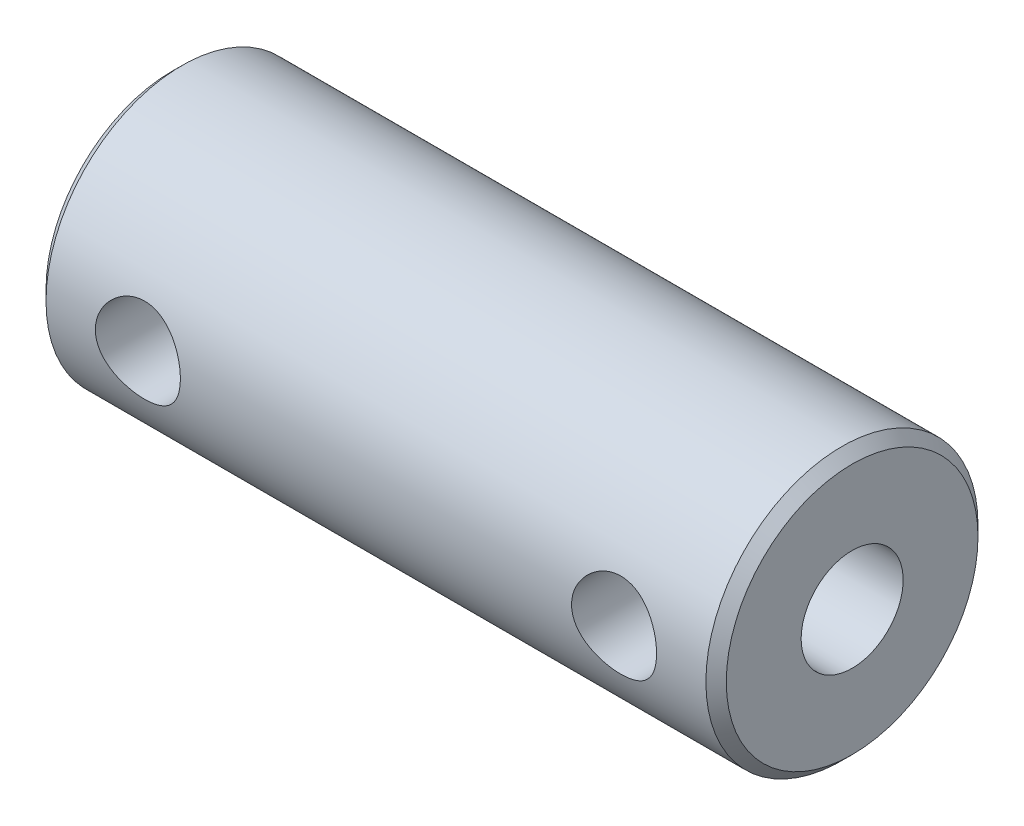
ISO-10303-21;
HEADER;
FILE_DESCRIPTION(('STEP AP214'),'2;1');
FILE_NAME('part.step','',(''),(''),'','','');
FILE_SCHEMA(('AUTOMOTIVE_DESIGN { 1 0 10303 214 1 1 1 1 }'));
ENDSEC;
DATA;
#1=APPLICATION_CONTEXT('core data for automotive mechanical design processes');
#2=APPLICATION_PROTOCOL_DEFINITION('international standard','automotive_design',2000,#1);
#3=PRODUCT_CONTEXT('',#1,'mechanical');
#4=PRODUCT('Part','Part','',(#3));
#5=PRODUCT_RELATED_PRODUCT_CATEGORY('part','',(#4));
#6=PRODUCT_DEFINITION_FORMATION('','',#4);
#7=PRODUCT_DEFINITION_CONTEXT('part definition',#1,'design');
#8=PRODUCT_DEFINITION('design','',#6,#7);
#9=PRODUCT_DEFINITION_SHAPE('','',#8);
#10=(LENGTH_UNIT() NAMED_UNIT(*) SI_UNIT(.MILLI.,.METRE.));
#11=(NAMED_UNIT(*) PLANE_ANGLE_UNIT() SI_UNIT($,.RADIAN.));
#12=(NAMED_UNIT(*) SI_UNIT($,.STERADIAN.) SOLID_ANGLE_UNIT());
#13=UNCERTAINTY_MEASURE_WITH_UNIT(LENGTH_MEASURE(1.E-05),#10,'distance_accuracy_value','');
#14=(GEOMETRIC_REPRESENTATION_CONTEXT(3) GLOBAL_UNCERTAINTY_ASSIGNED_CONTEXT((#13)) GLOBAL_UNIT_ASSIGNED_CONTEXT((#10,
#11,#12)) REPRESENTATION_CONTEXT('',''));
#15=CARTESIAN_POINT('',(0.,0.,0.));
#16=DIRECTION('',(0.,0.,1.));
#17=DIRECTION('',(1.,0.,0.));
#18=AXIS2_PLACEMENT_3D('',#15,#16,#17);
#19=CARTESIAN_POINT('',(-9.07995153098626,0.,0.));
#20=DIRECTION('',(-1.,0.,0.));
#21=DIRECTION('',(0.,0.,1.));
#22=AXIS2_PLACEMENT_3D('',#19,#20,#21);
#23=CYLINDRICAL_SURFACE('',#22,1.5);
#24=CARTESIAN_POINT('',(0.,0.,0.));
#25=DIRECTION('',(-1.,0.,0.));
#26=DIRECTION('',(0.,0.,1.));
#27=AXIS2_PLACEMENT_3D('',#24,#25,#26);
#28=CIRCLE('',#27,1.5);
#29=CARTESIAN_POINT('',(0.,0.,1.5));
#30=VERTEX_POINT('',#29);
#31=EDGE_CURVE('E133',#30,#30,#28,.T.);
#32=ORIENTED_EDGE('',*,*,#31,.T.);
#33=EDGE_LOOP('',(#32));
#34=FACE_BOUND('',#33,.T.);
#35=CARTESIAN_POINT('',(10.,0.,0.));
#36=DIRECTION('',(-1.,0.,0.));
#37=DIRECTION('',(0.,0.,1.));
#38=AXIS2_PLACEMENT_3D('',#35,#36,#37);
#39=CIRCLE('',#38,1.5);
#40=CARTESIAN_POINT('',(10.,0.,1.5));
#41=VERTEX_POINT('',#40);
#42=EDGE_CURVE('E136',#41,#41,#39,.T.);
#43=ORIENTED_EDGE('',*,*,#42,.F.);
#44=EDGE_LOOP('',(#43));
#45=FACE_BOUND('',#44,.T.);
#46=DIRECTION('',(-1.,0.,0.));
#47=VECTOR('',#46,1.);
#48=CARTESIAN_POINT('',(-9.07995153098626,1.01980390271856,1.1));
#49=LINE('',#48,#47);
#50=CARTESIAN_POINT('',(6.27715838525995,1.01980390271856,1.1));
#51=VERTEX_POINT('',#50);
#52=CARTESIAN_POINT('',(7.72284161474005,1.01980390271856,1.1));
#53=VERTEX_POINT('',#52);
#54=EDGE_CURVE('E11',#51,#53,#49,.F.);
#55=ORIENTED_EDGE('',*,*,#54,.F.);
#56=CARTESIAN_POINT('',(6.27715838525995,1.01980390271856,1.1));
#57=CARTESIAN_POINT('',(6.24785259282519,0.999017405526167,1.11927208545593));
#58=CARTESIAN_POINT('',(6.21946319998509,0.977009652242892,1.13857750945756));
#59=CARTESIAN_POINT('',(6.16453728134246,0.930487550768675,1.17690395854617));
#60=CARTESIAN_POINT('',(6.13800305191533,0.905970185426996,1.19592460903198));
#61=CARTESIAN_POINT('',(6.06096012847509,0.82827766767481,1.25222113353282));
#62=CARTESIAN_POINT('',(6.01342270298448,0.771251461066706,1.2884515372652));
#63=CARTESIAN_POINT('',(5.93683848070769,0.660115877649062,1.34809819249946));
#64=CARTESIAN_POINT('',(5.90600010710047,0.607829227947241,1.37261631231153));
#65=CARTESIAN_POINT('',(5.85168426404333,0.497621220402377,1.4162865896349));
#66=CARTESIAN_POINT('',(5.82818588913886,0.439716492670978,1.43545396999627));
#67=CARTESIAN_POINT('',(5.78962628254963,0.31869068161912,1.46709987769286));
#68=CARTESIAN_POINT('',(5.77465147957765,0.255523358584458,1.47950983204791));
#69=CARTESIAN_POINT('',(5.7547164693351,0.126546376993038,1.49606116121764));
#70=CARTESIAN_POINT('',(5.74975114698085,0.0607380855797199,1.50020675930374));
#71=CARTESIAN_POINT('',(5.75023095389339,-0.0611130290716277,1.49980806601887));
#72=CARTESIAN_POINT('',(5.75425655686159,-0.117173076205809,1.49644867267506));
#73=CARTESIAN_POINT('',(5.76962429301585,-0.227549935725818,1.48367985569633));
#74=CARTESIAN_POINT('',(5.78096525205282,-0.281867026395948,1.47427140296472));
#75=CARTESIAN_POINT('',(5.81008702175102,-0.386692076125774,1.45028482376772));
#76=CARTESIAN_POINT('',(5.82778008437459,-0.437241120707928,1.43577719211559));
#77=CARTESIAN_POINT('',(5.86880472989011,-0.534498808995069,1.40248310562481));
#78=CARTESIAN_POINT('',(5.89214132187734,-0.58120399131979,1.38369285046374));
#79=CARTESIAN_POINT('',(5.95473696669298,-0.689447607096832,1.33400604263065));
#80=CARTESIAN_POINT('',(5.99652791984288,-0.748729637974959,1.30137792620423));
#81=CARTESIAN_POINT('',(6.08810762633757,-0.85793741825479,1.23212182114316));
#82=CARTESIAN_POINT('',(6.13789966099809,-0.907859310700042,1.19549219343439));
#83=CARTESIAN_POINT('',(6.21893181140383,-0.9765929361314,1.13894818846832));
#84=CARTESIAN_POINT('',(6.24760224156318,-0.998834091657571,1.11945154799667));
#85=CARTESIAN_POINT('',(6.27715838525961,-1.01980390271899,1.10000000000004));
#86=B_SPLINE_CURVE_WITH_KNOTS('',3,(#56,#57,#58,#59,#60,#61,#62,#63,#64,#65,#66,#67,#68,#69,#70,
#71,#72,#73,#74,#75,#76,#77,#78,#79,#80,#81,#82,#83,#84,#85),.UNSPECIFIED.,.F.,.F.,(4,2,2,2,2,2,
2,2,2,2,2,2,2,2,4),(0.,0.122242169138908,0.244633068136593,0.491124183491871,0.686794669415566,
0.881902663882364,1.07895532935393,1.275907270654,1.44398459220969,1.61203494327416,
1.77784793365029,1.94380864033149,2.18112532498468,2.41853958491691,2.5419745325833),.UNSPECIFIED.);
#87=CARTESIAN_POINT('',(6.27715838525995,-1.01980390271856,1.1));
#88=VERTEX_POINT('',#87);
#89=EDGE_CURVE('E40',#51,#88,#86,.T.);
#90=ORIENTED_EDGE('',*,*,#89,.T.);
#91=DIRECTION('',(-1.,0.,0.));
#92=VECTOR('',#91,1.);
#93=CARTESIAN_POINT('',(-9.07995153098626,-1.01980390271856,1.1));
#94=LINE('',#93,#92);
#95=CARTESIAN_POINT('',(7.72284161474005,-1.01980390271856,1.1));
#96=VERTEX_POINT('',#95);
#97=EDGE_CURVE('E50',#96,#88,#94,.T.);
#98=ORIENTED_EDGE('',*,*,#97,.F.);
#99=CARTESIAN_POINT('',(7.72284161474005,-1.01980390271856,1.1));
#100=CARTESIAN_POINT('',(7.75214740717481,-0.999017405526167,1.11927208545593));
#101=CARTESIAN_POINT('',(7.78053680001491,-0.977009652242892,1.13857750945756));
#102=CARTESIAN_POINT('',(7.83546271865754,-0.930487550768675,1.17690395854617));
#103=CARTESIAN_POINT('',(7.86199694808467,-0.905970185426997,1.19592460903197));
#104=CARTESIAN_POINT('',(7.93903987152491,-0.828277667674811,1.25222113353282));
#105=CARTESIAN_POINT('',(7.98657729701552,-0.771251461066707,1.2884515372652));
#106=CARTESIAN_POINT('',(8.06316151929231,-0.660115877649063,1.34809819249946));
#107=CARTESIAN_POINT('',(8.09399989289953,-0.607829227947242,1.37261631231153));
#108=CARTESIAN_POINT('',(8.14831573595667,-0.497621220402377,1.4162865896349));
#109=CARTESIAN_POINT('',(8.17181411086114,-0.439716492670978,1.43545396999627));
#110=CARTESIAN_POINT('',(8.21037371745038,-0.318690681619119,1.46709987769286));
#111=CARTESIAN_POINT('',(8.22534852042235,-0.255523358584457,1.47950983204791));
#112=CARTESIAN_POINT('',(8.2452835306649,-0.126546376993037,1.49606116121764));
#113=CARTESIAN_POINT('',(8.25024885301915,-0.0607380855797184,1.50020675930374));
#114=CARTESIAN_POINT('',(8.24976904610661,0.0611130290716292,1.49980806601887));
#115=CARTESIAN_POINT('',(8.24574344313841,0.11717307620581,1.49644867267506));
#116=CARTESIAN_POINT('',(8.23037570698414,0.22754993572582,1.48367985569633));
#117=CARTESIAN_POINT('',(8.21903474794718,0.28186702639595,1.47427140296472));
#118=CARTESIAN_POINT('',(8.18991297824898,0.386692076125776,1.45028482376772));
#119=CARTESIAN_POINT('',(8.17221991562541,0.43724112070793,1.43577719211559));
#120=CARTESIAN_POINT('',(8.13119527010989,0.534498808995071,1.40248310562481));
#121=CARTESIAN_POINT('',(8.10785867812266,0.581203991319792,1.38369285046374));
#122=CARTESIAN_POINT('',(8.04526303330702,0.689447607096834,1.33400604263065));
#123=CARTESIAN_POINT('',(8.00347208015712,0.74872963797496,1.30137792620423));
#124=CARTESIAN_POINT('',(7.91189237366243,0.857937418254791,1.23212182114316));
#125=CARTESIAN_POINT('',(7.86210033900191,0.907859310700043,1.19549219343439));
#126=CARTESIAN_POINT('',(7.78106818859617,0.9765929361314,1.13894818846832));
#127=CARTESIAN_POINT('',(7.75239775843682,0.998834091657571,1.11945154799667));
#128=CARTESIAN_POINT('',(7.72284161474039,1.01980390271899,1.10000000000004));
#129=B_SPLINE_CURVE_WITH_KNOTS('',3,(#99,#100,#101,#102,#103,#104,#105,#106,#107,#108,#109,#110,
#111,#112,#113,#114,#115,#116,#117,#118,#119,#120,#121,#122,#123,#124,#125,#126,#127,#128),
.UNSPECIFIED.,.F.,.F.,(4,2,2,2,2,2,2,2,2,2,2,2,2,2,4),(0.,0.122242169138908,0.244633068136592,
0.491124183491871,0.686794669415565,0.881902663882364,1.07895532935393,1.275907270654,
1.44398459220969,1.61203494327417,1.77784793365029,1.9438086403315,2.18112532498469,
2.41853958491691,2.5419745325833),.UNSPECIFIED.);
#130=EDGE_CURVE('E67',#96,#53,#129,.T.);
#131=ORIENTED_EDGE('',*,*,#130,.T.);
#132=EDGE_LOOP('',(#55,#90,#98,#131));
#133=FACE_BOUND('',#132,.T.);
#134=ADVANCED_FACE('F32',(#34,#45,#133),#23,.F.);
#135=CARTESIAN_POINT('',(-9.7,0.,0.));
#136=DIRECTION('',(1.,0.,0.));
#137=DIRECTION('',(0.,0.,-1.));
#138=AXIS2_PLACEMENT_3D('',#135,#136,#137);
#139=CONICAL_SURFACE('',#138,4.,0.785398163397445);
#140=CARTESIAN_POINT('',(-10.,0.,0.));
#141=DIRECTION('',(-1.,0.,0.));
#142=DIRECTION('',(0.,0.,1.));
#143=AXIS2_PLACEMENT_3D('',#140,#141,#142);
#144=CIRCLE('',#143,3.7);
#145=CARTESIAN_POINT('',(-10.,0.,3.7));
#146=VERTEX_POINT('',#145);
#147=EDGE_CURVE('E169',#146,#146,#144,.T.);
#148=ORIENTED_EDGE('',*,*,#147,.F.);
#149=EDGE_LOOP('',(#148));
#150=FACE_BOUND('',#149,.T.);
#151=CARTESIAN_POINT('',(-9.7,0.,0.));
#152=DIRECTION('',(-1.,0.,0.));
#153=DIRECTION('',(0.,0.,1.));
#154=AXIS2_PLACEMENT_3D('',#151,#152,#153);
#155=CIRCLE('',#154,4.);
#156=CARTESIAN_POINT('',(-9.7,0.,4.));
#157=VERTEX_POINT('',#156);
#158=EDGE_CURVE('E71',#157,#157,#155,.T.);
#159=ORIENTED_EDGE('',*,*,#158,.T.);
#160=EDGE_LOOP('',(#159));
#161=FACE_BOUND('',#160,.T.);
#162=ADVANCED_FACE('F34',(#150,#161),#139,.T.);
#163=CARTESIAN_POINT('',(-9.07995153098626,0.,0.));
#164=DIRECTION('',(-1.,0.,0.));
#165=DIRECTION('',(0.,0.,1.));
#166=AXIS2_PLACEMENT_3D('',#163,#164,#165);
#167=CYLINDRICAL_SURFACE('',#166,4.);
#168=CARTESIAN_POINT('',(8.25,0.,4.));
#169=CARTESIAN_POINT('',(8.24999955341242,-0.0684391851745465,3.99999965877989));
#170=CARTESIAN_POINT('',(8.24436077305555,-0.136883052502859,3.99822694984841));
#171=CARTESIAN_POINT('',(8.22201375846076,-0.271769209588448,3.99132894088807));
#172=CARTESIAN_POINT('',(8.20530301863564,-0.338211042725907,3.98620288199859));
#173=CARTESIAN_POINT('',(8.16143062880426,-0.467128543650806,3.97315815697909));
#174=CARTESIAN_POINT('',(8.13428515534703,-0.529610176985803,3.96524381499025));
#175=CARTESIAN_POINT('',(8.07038268232167,-0.649134802346459,3.94743969161092));
#176=CARTESIAN_POINT('',(8.03362416821941,-0.706176935444884,3.93754959899905));
#177=CARTESIAN_POINT('',(7.95034400798264,-0.81496533495228,3.91650213740282));
#178=CARTESIAN_POINT('',(7.90357911493893,-0.86652002815666,3.90531715926989));
#179=CARTESIAN_POINT('',(7.80213160758645,-0.961197382036993,3.88310046374208));
#180=CARTESIAN_POINT('',(7.74744752250545,-1.0043184728987,3.87206877523457));
#181=CARTESIAN_POINT('',(7.63005543619192,-1.08194336483113,3.85111144698172));
#182=CARTESIAN_POINT('',(7.56718252247278,-1.11620784150129,3.84121988301795));
#183=CARTESIAN_POINT('',(7.43620768501813,-1.17359741076672,3.82407801799234));
#184=CARTESIAN_POINT('',(7.36810714420607,-1.19672543771945,3.81682702128688));
#185=CARTESIAN_POINT('',(7.23077192254794,-1.23048459930033,3.806076069845));
#186=CARTESIAN_POINT('',(7.16163315636115,-1.24147110007865,3.80246972929508));
#187=CARTESIAN_POINT('',(7.02240688108811,-1.25174555036988,3.7991005514095));
#188=CARTESIAN_POINT('',(6.95231962917834,-1.25103660995772,3.79933669227334));
#189=CARTESIAN_POINT('',(6.81612553973102,-1.23821824732739,3.80353189075438));
#190=CARTESIAN_POINT('',(6.74997087413844,-1.22656057869383,3.80734341745948));
#191=CARTESIAN_POINT('',(6.62060784346265,-1.19290813355626,3.81802025652489));
#192=CARTESIAN_POINT('',(6.5573997922912,-1.17091225844551,3.82488589343115));
#193=CARTESIAN_POINT('',(6.43464805556737,-1.11688874681277,3.84101044014296));
#194=CARTESIAN_POINT('',(6.37517138930802,-1.08471925662082,3.85030284660824));
#195=CARTESIAN_POINT('',(6.26231223212088,-1.01136020737848,3.8702185658007));
#196=CARTESIAN_POINT('',(6.20893132974629,-0.970168305215773,3.88084222394551));
#197=CARTESIAN_POINT('',(6.10722505658301,-0.877716954182124,3.90281527800493));
#198=CARTESIAN_POINT('',(6.05924044222032,-0.826084570592818,3.91417569605695));
#199=CARTESIAN_POINT('',(5.97252810642032,-0.715364408095531,3.9359157075958));
#200=CARTESIAN_POINT('',(5.93380107078079,-0.65627607734902,3.94629522838372));
#201=CARTESIAN_POINT('',(5.86647231139872,-0.531664610465454,3.96501294890191));
#202=CARTESIAN_POINT('',(5.83795186453603,-0.466094906919279,3.97333460648208));
#203=CARTESIAN_POINT('',(5.79244699914843,-0.330767977782644,3.98687955828554));
#204=CARTESIAN_POINT('',(5.7754590777616,-0.261012030724609,3.99210379325151));
#205=CARTESIAN_POINT('',(5.75408195742102,-0.122185157290345,3.99871389395014));
#206=CARTESIAN_POINT('',(5.74923145640648,-0.0531918487888428,4.00024022895439));
#207=CARTESIAN_POINT('',(5.75096622663733,0.0846303057325843,3.99969799730981));
#208=CARTESIAN_POINT('',(5.7575498273226,0.153459174306505,3.99762995581124));
#209=CARTESIAN_POINT('',(5.78159559260639,0.287219332975851,3.99022363769771));
#210=CARTESIAN_POINT('',(5.79878326761252,0.352204978420947,3.98496793110725));
#211=CARTESIAN_POINT('',(5.84321435236669,0.478351928861365,3.97180121379252));
#212=CARTESIAN_POINT('',(5.87045900402491,0.539512760449015,3.96388987514203));
#213=CARTESIAN_POINT('',(5.93497321654879,0.657932406672231,3.94598542759567));
#214=CARTESIAN_POINT('',(5.97247098749722,0.715059739787955,3.9359462681821));
#215=CARTESIAN_POINT('',(6.05615321011702,0.822365850960095,3.91493410002887));
#216=CARTESIAN_POINT('',(6.10234001774311,0.872542738043336,3.90396083845861));
#217=CARTESIAN_POINT('',(6.20425889005369,0.966587462919656,3.88176994885247));
#218=CARTESIAN_POINT('',(6.26029666374526,1.01012652339774,3.87055986714445));
#219=CARTESIAN_POINT('',(6.37912661637074,1.08721250244909,3.84961947087601));
#220=CARTESIAN_POINT('',(6.44191868800443,1.12075957972524,3.83988913281399));
#221=CARTESIAN_POINT('',(6.57234517288586,1.17670083481141,3.82311782360753));
#222=CARTESIAN_POINT('',(6.6399596495047,1.19913819558886,3.81606646468027));
#223=CARTESIAN_POINT('',(6.7782724933238,1.23222894320964,3.80551170941212));
#224=CARTESIAN_POINT('',(6.84896967637131,1.2428868141461,3.80200696302675));
#225=CARTESIAN_POINT('',(6.98800408755424,1.2517940615754,3.79908292712494));
#226=CARTESIAN_POINT('',(7.05630345381293,1.25058279621957,3.79948604683076));
#227=CARTESIAN_POINT('',(7.19167458491918,1.23708818129474,3.80390090472382));
#228=CARTESIAN_POINT('',(7.258746406884,1.22480534822559,3.80791247457319));
#229=CARTESIAN_POINT('',(7.38879403960178,1.18987729913378,3.81896814158112));
#230=CARTESIAN_POINT('',(7.45181544109601,1.16738642405944,3.82596698183474));
#231=CARTESIAN_POINT('',(7.57324041353135,1.11280227335064,3.84219704261348));
#232=CARTESIAN_POINT('',(7.63164304207768,1.08070704444254,3.85142871716522));
#233=CARTESIAN_POINT('',(7.74464597044057,1.00635675013475,3.8715348703158));
#234=CARTESIAN_POINT('',(7.79900812950044,0.963753335241274,3.88245948922441));
#235=CARTESIAN_POINT('',(7.8999863281118,0.870208996404849,3.90448998821726));
#236=CARTESIAN_POINT('',(7.946600288991,0.819265842344403,3.91559591606794));
#237=CARTESIAN_POINT('',(8.03228253836299,0.708486662823332,3.93717271952329));
#238=CARTESIAN_POINT('',(8.07105473644997,0.64841457448738,3.94761101730634));
#239=CARTESIAN_POINT('',(8.13789891513944,0.522279138013654,3.96626769296916));
#240=CARTESIAN_POINT('',(8.16597510214183,0.45621815779545,3.97448694315832));
#241=CARTESIAN_POINT('',(8.20859136760847,0.325747635373978,3.98720650733461));
#242=CARTESIAN_POINT('',(8.22407486730534,0.261670337112546,3.99196240806139));
#243=CARTESIAN_POINT('',(8.24477835996771,0.131729895440248,3.99835900340486));
#244=CARTESIAN_POINT('',(8.250000429804,0.0658671161396749,4.00000032839643));
#245=CARTESIAN_POINT('',(8.25,0.,4.));
#246=B_SPLINE_CURVE_WITH_KNOTS('',3,(#168,#169,#170,#171,#172,#173,#174,#175,#176,#177,#178,
#179,#180,#181,#182,#183,#184,#185,#186,#187,#188,#189,#190,#191,#192,#193,#194,#195,#196,#197,
#198,#199,#200,#201,#202,#203,#204,#205,#206,#207,#208,#209,#210,#211,#212,#213,#214,#215,#216,
#217,#218,#219,#220,#221,#222,#223,#224,#225,#226,#227,#228,#229,#230,#231,#232,#233,#234,#235,
#236,#237,#238,#239,#240,#241,#242,#243,#244,#245),.UNSPECIFIED.,.T.,.F.,(4,2,2,2,2,2,2,2,2,2,2,
2,2,2,2,2,2,2,2,2,2,2,2,2,2,2,2,2,2,2,2,2,2,2,2,2,2,2,4),(0.,0.20507544943251,0.410197323349066,
0.615002479202436,0.819839921558391,1.03037822195158,1.24095567431276,1.45673771247494,
1.67246286279527,1.8816915016721,2.09086450295138,2.29176917422169,2.49269519979063,
2.69655642720545,2.90047066010358,3.113667472796,3.32688007413303,3.5417546068977,
3.75656384494554,3.96307568548237,4.16955735649363,4.37090626722872,4.572280050345,
4.77856324738343,4.98490245709259,5.1994177871314,5.41392970983712,5.62760115751031,
5.84119123892431,6.04512203476054,6.24904331751085,6.44997913396671,6.65095584330174,
6.85979514006362,7.06869037373341,7.28440668126413,7.50003806666337,7.69744636651541,
7.89481470763048),.UNSPECIFIED.);
#247=CARTESIAN_POINT('',(8.25,0.,4.));
#248=VERTEX_POINT('',#247);
#249=EDGE_CURVE('E68',#248,#248,#246,.T.);
#250=ORIENTED_EDGE('',*,*,#249,.T.);
#251=EDGE_LOOP('',(#250));
#252=FACE_BOUND('',#251,.T.);
#253=CARTESIAN_POINT('',(-5.75,0.,4.));
#254=CARTESIAN_POINT('',(-5.75000044658758,-0.0684391851745464,3.99999965877989));
#255=CARTESIAN_POINT('',(-5.75563922694445,-0.136883052502859,3.99822694984841));
#256=CARTESIAN_POINT('',(-5.77798624153924,-0.271769209588448,3.99132894088807));
#257=CARTESIAN_POINT('',(-5.79469698136436,-0.338211042725907,3.98620288199859));
#258=CARTESIAN_POINT('',(-5.83856937119574,-0.467128543650806,3.97315815697909));
#259=CARTESIAN_POINT('',(-5.86571484465297,-0.529610176985803,3.96524381499025));
#260=CARTESIAN_POINT('',(-5.92961731767833,-0.649134802346459,3.94743969161092));
#261=CARTESIAN_POINT('',(-5.96637583178059,-0.706176935444884,3.93754959899905));
#262=CARTESIAN_POINT('',(-6.04965599201736,-0.81496533495228,3.91650213740282));
#263=CARTESIAN_POINT('',(-6.09642088506107,-0.866520028156659,3.90531715926989));
#264=CARTESIAN_POINT('',(-6.19786839241355,-0.961197382036993,3.88310046374208));
#265=CARTESIAN_POINT('',(-6.25255247749455,-1.0043184728987,3.87206877523457));
#266=CARTESIAN_POINT('',(-6.36994456380808,-1.08194336483113,3.85111144698172));
#267=CARTESIAN_POINT('',(-6.43281747752722,-1.11620784150129,3.84121988301795));
#268=CARTESIAN_POINT('',(-6.56379231498187,-1.17359741076672,3.82407801799234));
#269=CARTESIAN_POINT('',(-6.63189285579393,-1.19672543771945,3.81682702128688));
#270=CARTESIAN_POINT('',(-6.76922807745206,-1.23048459930033,3.806076069845));
#271=CARTESIAN_POINT('',(-6.83836684363885,-1.24147110007865,3.80246972929508));
#272=CARTESIAN_POINT('',(-6.97759311891189,-1.25174555036988,3.7991005514095));
#273=CARTESIAN_POINT('',(-7.04768037082166,-1.25103660995772,3.79933669227334));
#274=CARTESIAN_POINT('',(-7.18387446026898,-1.23821824732739,3.80353189075438));
#275=CARTESIAN_POINT('',(-7.25002912586156,-1.22656057869383,3.80734341745948));
#276=CARTESIAN_POINT('',(-7.37939215653735,-1.19290813355626,3.81802025652489));
#277=CARTESIAN_POINT('',(-7.4426002077088,-1.17091225844551,3.82488589343115));
#278=CARTESIAN_POINT('',(-7.56535194443263,-1.11688874681277,3.84101044014296));
#279=CARTESIAN_POINT('',(-7.62482861069198,-1.08471925662082,3.85030284660824));
#280=CARTESIAN_POINT('',(-7.73768776787912,-1.01136020737848,3.8702185658007));
#281=CARTESIAN_POINT('',(-7.79106867025371,-0.970168305215774,3.88084222394551));
#282=CARTESIAN_POINT('',(-7.89277494341699,-0.877716954182125,3.90281527800493));
#283=CARTESIAN_POINT('',(-7.94075955777968,-0.826084570592819,3.91417569605695));
#284=CARTESIAN_POINT('',(-8.02747189357968,-0.715364408095532,3.9359157075958));
#285=CARTESIAN_POINT('',(-8.06619892921921,-0.656276077349021,3.94629522838372));
#286=CARTESIAN_POINT('',(-8.13352768860127,-0.531664610465455,3.96501294890191));
#287=CARTESIAN_POINT('',(-8.16204813546397,-0.46609490691928,3.97333460648208));
#288=CARTESIAN_POINT('',(-8.20755300085157,-0.330767977782646,3.98687955828554));
#289=CARTESIAN_POINT('',(-8.2245409222384,-0.261012030724609,3.99210379325151));
#290=CARTESIAN_POINT('',(-8.24591804257898,-0.122185157290345,3.99871389395014));
#291=CARTESIAN_POINT('',(-8.25076854359352,-0.0531918487888428,4.00024022895439));
#292=CARTESIAN_POINT('',(-8.24903377336267,0.0846303057325843,3.99969799730981));
#293=CARTESIAN_POINT('',(-8.2424501726774,0.153459174306505,3.99762995581124));
#294=CARTESIAN_POINT('',(-8.21840440739361,0.287219332975851,3.99022363769771));
#295=CARTESIAN_POINT('',(-8.20121673238748,0.352204978420948,3.98496793110725));
#296=CARTESIAN_POINT('',(-8.15678564763331,0.478351928861365,3.97180121379252));
#297=CARTESIAN_POINT('',(-8.12954099597509,0.539512760449015,3.96388987514203));
#298=CARTESIAN_POINT('',(-8.06502678345121,0.657932406672231,3.94598542759567));
#299=CARTESIAN_POINT('',(-8.02752901250278,0.715059739787955,3.9359462681821));
#300=CARTESIAN_POINT('',(-7.94384678988299,0.822365850960095,3.91493410002887));
#301=CARTESIAN_POINT('',(-7.89765998225689,0.872542738043335,3.90396083845861));
#302=CARTESIAN_POINT('',(-7.79574110994631,0.966587462919656,3.88176994885247));
#303=CARTESIAN_POINT('',(-7.73970333625474,1.01012652339774,3.87055986714445));
#304=CARTESIAN_POINT('',(-7.62087338362926,1.08721250244909,3.84961947087601));
#305=CARTESIAN_POINT('',(-7.55808131199557,1.12075957972524,3.83988913281399));
#306=CARTESIAN_POINT('',(-7.42765482711414,1.17670083481141,3.82311782360753));
#307=CARTESIAN_POINT('',(-7.3600403504953,1.19913819558886,3.81606646468027));
#308=CARTESIAN_POINT('',(-7.2217275066762,1.23222894320964,3.80551170941212));
#309=CARTESIAN_POINT('',(-7.15103032362869,1.2428868141461,3.80200696302675));
#310=CARTESIAN_POINT('',(-7.01199591244576,1.2517940615754,3.79908292712494));
#311=CARTESIAN_POINT('',(-6.94369654618707,1.25058279621957,3.79948604683076));
#312=CARTESIAN_POINT('',(-6.80832541508082,1.23708818129474,3.80390090472382));
#313=CARTESIAN_POINT('',(-6.741253593116,1.22480534822559,3.80791247457319));
#314=CARTESIAN_POINT('',(-6.61120596039822,1.18987729913378,3.81896814158112));
#315=CARTESIAN_POINT('',(-6.54818455890399,1.16738642405944,3.82596698183474));
#316=CARTESIAN_POINT('',(-6.42675958646865,1.11280227335064,3.84219704261348));
#317=CARTESIAN_POINT('',(-6.36835695792232,1.08070704444254,3.85142871716522));
#318=CARTESIAN_POINT('',(-6.25535402955944,1.00635675013475,3.8715348703158));
#319=CARTESIAN_POINT('',(-6.20099187049956,0.963753335241275,3.88245948922441));
#320=CARTESIAN_POINT('',(-6.1000136718882,0.87020899640485,3.90448998821726));
#321=CARTESIAN_POINT('',(-6.053399711009,0.819265842344404,3.91559591606794));
#322=CARTESIAN_POINT('',(-5.96771746163701,0.708486662823332,3.93717271952329));
#323=CARTESIAN_POINT('',(-5.92894526355003,0.64841457448738,3.94761101730634));
#324=CARTESIAN_POINT('',(-5.86210108486056,0.522279138013654,3.96626769296916));
#325=CARTESIAN_POINT('',(-5.83402489785817,0.456218157795449,3.97448694315832));
#326=CARTESIAN_POINT('',(-5.79140863239153,0.325747635373978,3.98720650733461));
#327=CARTESIAN_POINT('',(-5.77592513269466,0.261670337112546,3.99196240806139));
#328=CARTESIAN_POINT('',(-5.75522164003229,0.131729895440248,3.99835900340486));
#329=CARTESIAN_POINT('',(-5.749999570196,0.0658671161396748,4.00000032839643));
#330=CARTESIAN_POINT('',(-5.75,0.,4.));
#331=B_SPLINE_CURVE_WITH_KNOTS('',3,(#253,#254,#255,#256,#257,#258,#259,#260,#261,#262,#263,
#264,#265,#266,#267,#268,#269,#270,#271,#272,#273,#274,#275,#276,#277,#278,#279,#280,#281,#282,
#283,#284,#285,#286,#287,#288,#289,#290,#291,#292,#293,#294,#295,#296,#297,#298,#299,#300,#301,
#302,#303,#304,#305,#306,#307,#308,#309,#310,#311,#312,#313,#314,#315,#316,#317,#318,#319,#320,
#321,#322,#323,#324,#325,#326,#327,#328,#329,#330),.UNSPECIFIED.,.T.,.F.,(4,2,2,2,2,2,2,2,2,2,2,
2,2,2,2,2,2,2,2,2,2,2,2,2,2,2,2,2,2,2,2,2,2,2,2,2,2,2,4),(0.,0.20507544943251,0.410197323349066,
0.615002479202436,0.819839921558391,1.03037822195158,1.24095567431276,1.45673771247494,
1.67246286279527,1.8816915016721,2.09086450295138,2.29176917422169,2.49269519979063,
2.69655642720545,2.90047066010358,3.113667472796,3.32688007413303,3.5417546068977,
3.75656384494554,3.96307568548237,4.16955735649363,4.37090626722872,4.572280050345,
4.77856324738343,4.98490245709259,5.1994177871314,5.41392970983712,5.62760115751031,
5.84119123892431,6.04512203476054,6.24904331751085,6.44997913396671,6.65095584330174,
6.85979514006362,7.06869037373341,7.28440668126413,7.50003806666337,7.69744636651541,
7.89481470763048),.UNSPECIFIED.);
#332=CARTESIAN_POINT('',(-5.75,0.,4.));
#333=VERTEX_POINT('',#332);
#334=EDGE_CURVE('E100',#333,#333,#331,.T.);
#335=ORIENTED_EDGE('',*,*,#334,.T.);
#336=EDGE_LOOP('',(#335));
#337=FACE_BOUND('',#336,.T.);
#338=ORIENTED_EDGE('',*,*,#158,.F.);
#339=EDGE_LOOP('',(#338));
#340=FACE_BOUND('',#339,.T.);
#341=CARTESIAN_POINT('',(9.7,0.,0.));
#342=DIRECTION('',(-1.,0.,0.));
#343=DIRECTION('',(0.,0.,1.));
#344=AXIS2_PLACEMENT_3D('',#341,#342,#343);
#345=CIRCLE('',#344,4.);
#346=CARTESIAN_POINT('',(9.7,0.,4.));
#347=VERTEX_POINT('',#346);
#348=EDGE_CURVE('E140',#347,#347,#345,.T.);
#349=ORIENTED_EDGE('',*,*,#348,.T.);
#350=EDGE_LOOP('',(#349));
#351=FACE_BOUND('',#350,.T.);
#352=ADVANCED_FACE('F104',(#252,#337,#340,#351),#167,.T.);
#353=CARTESIAN_POINT('',(10.,0.,0.));
#354=DIRECTION('',(-1.,0.,0.));
#355=DIRECTION('',(0.,0.,1.));
#356=AXIS2_PLACEMENT_3D('',#353,#354,#355);
#357=CONICAL_SURFACE('',#356,3.7,0.785398163397451);
#358=ORIENTED_EDGE('',*,*,#348,.F.);
#359=EDGE_LOOP('',(#358));
#360=FACE_BOUND('',#359,.T.);
#361=CARTESIAN_POINT('',(10.,0.,0.));
#362=DIRECTION('',(-1.,0.,0.));
#363=DIRECTION('',(0.,0.,1.));
#364=AXIS2_PLACEMENT_3D('',#361,#362,#363);
#365=CIRCLE('',#364,3.7);
#366=CARTESIAN_POINT('',(10.,0.,3.7));
#367=VERTEX_POINT('',#366);
#368=EDGE_CURVE('E137',#367,#367,#365,.T.);
#369=ORIENTED_EDGE('',*,*,#368,.T.);
#370=EDGE_LOOP('',(#369));
#371=FACE_BOUND('',#370,.T.);
#372=ADVANCED_FACE('F108',(#360,#371),#357,.T.);
#373=CARTESIAN_POINT('',(10.,1.5,0.));
#374=DIRECTION('',(-1.,0.,0.));
#375=DIRECTION('',(0.,0.,1.));
#376=AXIS2_PLACEMENT_3D('',#373,#374,#375);
#377=PLANE('',#376);
#378=ORIENTED_EDGE('',*,*,#368,.F.);
#379=EDGE_LOOP('',(#378));
#380=FACE_BOUND('',#379,.T.);
#381=ORIENTED_EDGE('',*,*,#42,.T.);
#382=EDGE_LOOP('',(#381));
#383=FACE_BOUND('',#382,.T.);
#384=ADVANCED_FACE('F112',(#380,#383),#377,.F.);
#385=CARTESIAN_POINT('',(0.,2.,0.));
#386=DIRECTION('',(1.,0.,0.));
#387=DIRECTION('',(0.,0.,-1.));
#388=AXIS2_PLACEMENT_3D('',#385,#386,#387);
#389=PLANE('',#388);
#390=ORIENTED_EDGE('',*,*,#31,.F.);
#391=EDGE_LOOP('',(#390));
#392=FACE_BOUND('',#391,.T.);
#393=CARTESIAN_POINT('',(0.,0.,0.));
#394=DIRECTION('',(-1.,0.,0.));
#395=DIRECTION('',(0.,0.,1.));
#396=AXIS2_PLACEMENT_3D('',#393,#394,#395);
#397=CIRCLE('',#396,2.);
#398=CARTESIAN_POINT('',(0.,0.,2.));
#399=VERTEX_POINT('',#398);
#400=EDGE_CURVE('E142',#399,#399,#397,.T.);
#401=ORIENTED_EDGE('',*,*,#400,.T.);
#402=EDGE_LOOP('',(#401));
#403=FACE_BOUND('',#402,.T.);
#404=ADVANCED_FACE('F115',(#392,#403),#389,.F.);
#405=CARTESIAN_POINT('',(-9.07995153098626,0.,0.));
#406=DIRECTION('',(-1.,0.,0.));
#407=DIRECTION('',(0.,0.,1.));
#408=AXIS2_PLACEMENT_3D('',#405,#406,#407);
#409=CYLINDRICAL_SURFACE('',#408,2.);
#410=CARTESIAN_POINT('',(-5.75,0.,2.));
#411=CARTESIAN_POINT('',(-5.75000434999878,0.0635104730002027,1.99999595305313));
#412=CARTESIAN_POINT('',(-5.75487301181781,0.127096441053758,1.99694323311001));
#413=CARTESIAN_POINT('',(-5.7740858034295,0.252318262265282,1.98502167724102));
#414=CARTESIAN_POINT('',(-5.78844799392548,0.313950163299073,1.97614175574896));
#415=CARTESIAN_POINT('',(-5.82581136316205,0.433205558136783,1.95345852982134));
#416=CARTESIAN_POINT('',(-5.84876978784088,0.490847243665017,1.93967960778663));
#417=CARTESIAN_POINT('',(-5.90238585079675,0.601260368868361,1.90834598486073));
#418=CARTESIAN_POINT('',(-5.93304263600919,0.654032347276153,1.89079170235271));
#419=CARTESIAN_POINT('',(-6.00388657318497,0.757974192167973,1.85170152902273));
#420=CARTESIAN_POINT('',(-6.04463929997545,0.808679560769977,1.82995962224617));
#421=CARTESIAN_POINT('',(-6.13321917450655,0.902986375146759,1.78531349913632));
#422=CARTESIAN_POINT('',(-6.18105582825794,0.946578107215734,1.76240774858553));
#423=CARTESIAN_POINT('',(-6.29003389420452,1.03142873237132,1.71430418655199));
#424=CARTESIAN_POINT('',(-6.35209978660728,1.07157206029151,1.68921610993412));
#425=CARTESIAN_POINT('',(-6.48356481544719,1.14073966020039,1.64330198128731));
#426=CARTESIAN_POINT('',(-6.55295131257608,1.16978270899534,1.62246875996238));
#427=CARTESIAN_POINT('',(-6.67881052377872,1.20933400585981,1.59309575627364));
#428=CARTESIAN_POINT('',(-6.73396681853882,1.22269552371394,1.58276905990074));
#429=CARTESIAN_POINT('',(-6.8463059256108,1.2418184358548,1.56781357325805));
#430=CARTESIAN_POINT('',(-6.90348575827449,1.24759056342088,1.56317673673692));
#431=CARTESIAN_POINT('',(-7.01841301675112,1.2511891824572,1.56029885782827));
#432=CARTESIAN_POINT('',(-7.0761615364624,1.24899483727851,1.56207458771719));
#433=CARTESIAN_POINT('',(-7.19031010318896,1.23676317046804,1.5717740238392));
#434=CARTESIAN_POINT('',(-7.24670903203908,1.22671956265043,1.5797026576711));
#435=CARTESIAN_POINT('',(-7.35543845265748,1.19968103371474,1.60032573121781));
#436=CARTESIAN_POINT('',(-7.40783245568427,1.18285016736897,1.61290715104814));
#437=CARTESIAN_POINT('',(-7.50916118240542,1.14290189820937,1.64145566443406));
#438=CARTESIAN_POINT('',(-7.5580946748745,1.11978227193696,1.65742395501354));
#439=CARTESIAN_POINT('',(-7.66083327383274,1.06294892954949,1.6945481599302));
#440=CARTESIAN_POINT('',(-7.71384081012039,1.0280629660117,1.71611591575959));
#441=CARTESIAN_POINT('',(-7.81383027900048,0.950881463002101,1.76005711791243));
#442=CARTESIAN_POINT('',(-7.86080593170652,0.908578308011437,1.78243137335976));
#443=CARTESIAN_POINT('',(-7.9553017493704,0.809519713023331,1.82979894916857));
#444=CARTESIAN_POINT('',(-8.00163297425883,0.751531353595333,1.85461531676593));
#445=CARTESIAN_POINT('',(-8.08385089588725,0.627148099593569,1.90028055062445));
#446=CARTESIAN_POINT('',(-8.11974169772893,0.560756523881998,1.92113097514764));
#447=CARTESIAN_POINT('',(-8.17776368838142,0.424883562934748,1.95553372961316));
#448=CARTESIAN_POINT('',(-8.20053403998119,0.35576345773237,1.96941976591574));
#449=CARTESIAN_POINT('',(-8.23376492798281,0.213612154574975,1.98984929310048));
#450=CARTESIAN_POINT('',(-8.244242894222,0.140586648341304,1.9964031799007));
#451=CARTESIAN_POINT('',(-8.2515658500612,0.00451561874058808,2.00097840540091));
#452=CARTESIAN_POINT('',(-8.25020317795385,-0.0584027741637855,2.00012161345511));
#453=CARTESIAN_POINT('',(-8.23811717157927,-0.18297211799631,1.99258901494327));
#454=CARTESIAN_POINT('',(-8.22739447490783,-0.244623154962734,1.98591360473591));
#455=CARTESIAN_POINT('',(-8.19776146330804,-0.36252107065819,1.9677405228307));
#456=CARTESIAN_POINT('',(-8.17918784320335,-0.418885009953205,1.95644170526844));
#457=CARTESIAN_POINT('',(-8.13470361072144,-0.527638281070989,1.92995684104751));
#458=CARTESIAN_POINT('',(-8.10879176974485,-0.580026945470716,1.91477014350266));
#459=CARTESIAN_POINT('',(-8.04748479400452,-0.685084056277257,1.87990012356));
#460=CARTESIAN_POINT('',(-8.01139643076176,-0.737246967843405,1.85991764817225));
#461=CARTESIAN_POINT('',(-7.93220613484719,-0.835142640217341,1.81806970001717));
#462=CARTESIAN_POINT('',(-7.88909641074546,-0.880868151291855,1.79620214826384));
#463=CARTESIAN_POINT('',(-7.78986496058735,-0.971474198022884,1.74905869713091));
#464=CARTESIAN_POINT('',(-7.73276279370522,-1.01526851939752,1.72374883414957));
#465=CARTESIAN_POINT('',(-7.61112421505574,-1.09280351885684,1.67566762748172));
#466=CARTESIAN_POINT('',(-7.54659299324701,-1.12655115718694,1.65289453322336));
#467=CARTESIAN_POINT('',(-7.42530785194312,-1.17684772011828,1.61733530314592));
#468=CARTESIAN_POINT('',(-7.36975924926778,-1.19551895865479,1.6034563619378));
#469=CARTESIAN_POINT('',(-7.25560685423108,-1.22500108205245,1.58105030663767));
#470=CARTESIAN_POINT('',(-7.19700799054854,-1.23582424983127,1.57251483242605));
#471=CARTESIAN_POINT('',(-7.07790972311931,-1.24901383653654,1.56206324988732));
#472=CARTESIAN_POINT('',(-7.01740141451183,-1.25133186963292,1.56018501674569));
#473=CARTESIAN_POINT('',(-6.89686903963396,-1.24719778716818,1.56349063109847));
#474=CARTESIAN_POINT('',(-6.83684514099049,-1.24074275650143,1.56867682595586));
#475=CARTESIAN_POINT('',(-6.72397020494864,-1.220382724034,1.58455388771334));
#476=CARTESIAN_POINT('',(-6.67093069858359,-1.2071191949977,1.5947680805106));
#477=CARTESIAN_POINT('',(-6.56786494041409,-1.17417623469513,1.6191753043569));
#478=CARTESIAN_POINT('',(-6.5178399554625,-1.15449412799407,1.63336999423727));
#479=CARTESIAN_POINT('',(-6.4144032561273,-1.10602690439618,1.66663902886518));
#480=CARTESIAN_POINT('',(-6.36154970152345,-1.0763364445546,1.68612230498997));
#481=CARTESIAN_POINT('',(-6.261061632754,-1.0100001703639,1.72667706411868));
#482=CARTESIAN_POINT('',(-6.21343138743952,-0.973348732866944,1.74774982276825));
#483=CARTESIAN_POINT('',(-6.11498574502216,-0.885670221416064,1.79401910731181));
#484=CARTESIAN_POINT('',(-6.06540915455452,-0.833233674246798,1.81920541808776));
#485=CARTESIAN_POINT('',(-5.97550517029476,-0.719822446025207,1.86698729056748));
#486=CARTESIAN_POINT('',(-5.9351835040726,-0.658842515138553,1.88958124364395));
#487=CARTESIAN_POINT('',(-5.8652288698759,-0.529355399891412,1.92986710976548));
#488=CARTESIAN_POINT('',(-5.83561399459416,-0.460835727056574,1.94755071355356));
#489=CARTESIAN_POINT('',(-5.78892811566826,-0.318394712729503,1.97581521637842));
#490=CARTESIAN_POINT('',(-5.77181276513022,-0.244493501106853,1.98642121428689));
#491=CARTESIAN_POINT('',(-5.75770079083737,-0.141418481224667,1.99519472168143));
#492=CARTESIAN_POINT('',(-5.75481813466603,-0.113248608862872,1.99699172226301));
#493=CARTESIAN_POINT('',(-5.7509667084624,-0.056724186487091,1.9993953021324));
#494=CARTESIAN_POINT('',(-5.74999805689001,-0.0283696251514533,2.00000180773911));
#495=CARTESIAN_POINT('',(-5.75,0.,2.));
#496=B_SPLINE_CURVE_WITH_KNOTS('',3,(#410,#411,#412,#413,#414,#415,#416,#417,#418,#419,#420,
#421,#422,#423,#424,#425,#426,#427,#428,#429,#430,#431,#432,#433,#434,#435,#436,#437,#438,#439,
#440,#441,#442,#443,#444,#445,#446,#447,#448,#449,#450,#451,#452,#453,#454,#455,#456,#457,#458,
#459,#460,#461,#462,#463,#464,#465,#466,#467,#468,#469,#470,#471,#472,#473,#474,#475,#476,#477,
#478,#479,#480,#481,#482,#483,#484,#485,#486,#487,#488,#489,#490,#491,#492,#493,#494,#495),
.UNSPECIFIED.,.T.,.F.,(4,2,2,2,2,2,2,2,2,2,2,2,2,2,2,2,2,2,2,2,2,2,2,2,2,2,2,2,2,2,2,2,2,2,2,2,
2,2,2,2,2,2,4),(0.,0.190412301434133,0.381187894128462,0.571026987595137,0.760845054038796,
0.965821870536218,1.17107628325702,1.40412975852973,1.63678724607011,1.80912008879717,
1.98120894707391,2.15374823498778,2.32642584505083,2.49515839460437,2.66395067908033,
2.8642745035436,3.06480522575182,3.29842180699522,3.53194640727861,3.75284174135959,
3.97342347958131,4.16127180597573,4.34910733732281,4.52959504531298,4.71011298928467,
4.90885230990553,5.10781368827686,5.33565708863713,5.56334227196911,5.7432994031372,
5.92297427413352,6.103669746882,6.28442527563864,6.45063169037741,6.61690747313442,
6.80725523036979,6.99775741153769,7.22600539035112,7.454394245785,7.68316725607078,
7.91112460944408,7.9961750123248,8.08123067890588),.UNSPECIFIED.);
#497=CARTESIAN_POINT('',(-5.75,0.,2.));
#498=VERTEX_POINT('',#497);
#499=EDGE_CURVE('E99',#498,#498,#496,.T.);
#500=ORIENTED_EDGE('',*,*,#499,.T.);
#501=EDGE_LOOP('',(#500));
#502=FACE_BOUND('',#501,.T.);
#503=ORIENTED_EDGE('',*,*,#400,.F.);
#504=EDGE_LOOP('',(#503));
#505=FACE_BOUND('',#504,.T.);
#506=CARTESIAN_POINT('',(-10.,0.,0.));
#507=DIRECTION('',(-1.,0.,0.));
#508=DIRECTION('',(0.,0.,1.));
#509=AXIS2_PLACEMENT_3D('',#506,#507,#508);
#510=CIRCLE('',#509,2.);
#511=CARTESIAN_POINT('',(-10.,0.,2.));
#512=VERTEX_POINT('',#511);
#513=EDGE_CURVE('E166',#512,#512,#510,.T.);
#514=ORIENTED_EDGE('',*,*,#513,.T.);
#515=EDGE_LOOP('',(#514));
#516=FACE_BOUND('',#515,.T.);
#517=ADVANCED_FACE('F120',(#502,#505,#516),#409,.F.);
#518=CARTESIAN_POINT('',(-10.,3.7,0.));
#519=DIRECTION('',(1.,0.,0.));
#520=DIRECTION('',(0.,0.,-1.));
#521=AXIS2_PLACEMENT_3D('',#518,#519,#520);
#522=PLANE('',#521);
#523=ORIENTED_EDGE('',*,*,#513,.F.);
#524=EDGE_LOOP('',(#523));
#525=FACE_BOUND('',#524,.T.);
#526=ORIENTED_EDGE('',*,*,#147,.T.);
#527=EDGE_LOOP('',(#526));
#528=FACE_BOUND('',#527,.T.);
#529=ADVANCED_FACE('F155',(#525,#528),#522,.F.);
#530=CARTESIAN_POINT('',(-7.,0.,1.1));
#531=DIRECTION('',(0.,0.,1.));
#532=DIRECTION('',(1.,0.,0.));
#533=AXIS2_PLACEMENT_3D('',#530,#531,#532);
#534=CYLINDRICAL_SURFACE('',#533,1.25);
#535=ORIENTED_EDGE('',*,*,#499,.F.);
#536=EDGE_LOOP('',(#535));
#537=FACE_BOUND('',#536,.T.);
#538=ORIENTED_EDGE('',*,*,#334,.F.);
#539=EDGE_LOOP('',(#538));
#540=FACE_BOUND('',#539,.T.);
#541=ADVANCED_FACE('F89',(#537,#540),#534,.F.);
#542=CARTESIAN_POINT('',(7.,0.,1.1));
#543=DIRECTION('',(0.,0.,1.));
#544=DIRECTION('',(1.,0.,0.));
#545=AXIS2_PLACEMENT_3D('',#542,#543,#544);
#546=CYLINDRICAL_SURFACE('',#545,1.25);
#547=CARTESIAN_POINT('',(7.,0.,1.1));
#548=DIRECTION('',(0.,0.,1.));
#549=DIRECTION('',(1.,0.,0.));
#550=AXIS2_PLACEMENT_3D('',#547,#548,#549);
#551=CIRCLE('',#550,1.25);
#552=EDGE_CURVE('E60',#53,#51,#551,.T.);
#553=ORIENTED_EDGE('',*,*,#552,.F.);
#554=ORIENTED_EDGE('',*,*,#130,.F.);
#555=EDGE_CURVE('E46',#88,#96,#551,.T.);
#556=ORIENTED_EDGE('',*,*,#555,.F.);
#557=ORIENTED_EDGE('',*,*,#89,.F.);
#558=EDGE_LOOP('',(#553,#554,#556,#557));
#559=FACE_BOUND('',#558,.T.);
#560=ORIENTED_EDGE('',*,*,#249,.F.);
#561=EDGE_LOOP('',(#560));
#562=FACE_BOUND('',#561,.T.);
#563=ADVANCED_FACE('F65',(#559,#562),#546,.F.);
#564=CARTESIAN_POINT('',(7.,0.,1.1));
#565=DIRECTION('',(0.,0.,1.));
#566=DIRECTION('',(1.,0.,0.));
#567=AXIS2_PLACEMENT_3D('',#564,#565,#566);
#568=PLANE('',#567);
#569=ORIENTED_EDGE('',*,*,#54,.T.);
#570=ORIENTED_EDGE('',*,*,#552,.T.);
#571=EDGE_LOOP('',(#569,#570));
#572=FACE_BOUND('',#571,.T.);
#573=ADVANCED_FACE('F59',(#572),#568,.T.);
#574=ORIENTED_EDGE('',*,*,#97,.T.);
#575=ORIENTED_EDGE('',*,*,#555,.T.);
#576=EDGE_LOOP('',(#574,#575));
#577=FACE_BOUND('',#576,.T.);
#578=ADVANCED_FACE('F200',(#577),#568,.T.);
#579=CLOSED_SHELL('',(#134,#162,#352,#372,#384,#404,#517,#529,#541,#563,#573,#578));
#580=MANIFOLD_SOLID_BREP('B2',#579);
#581=ADVANCED_BREP_SHAPE_REPRESENTATION('',(#18,#580),#14);
#582=SHAPE_DEFINITION_REPRESENTATION(#9,#581);
ENDSEC;
END-ISO-10303-21;
